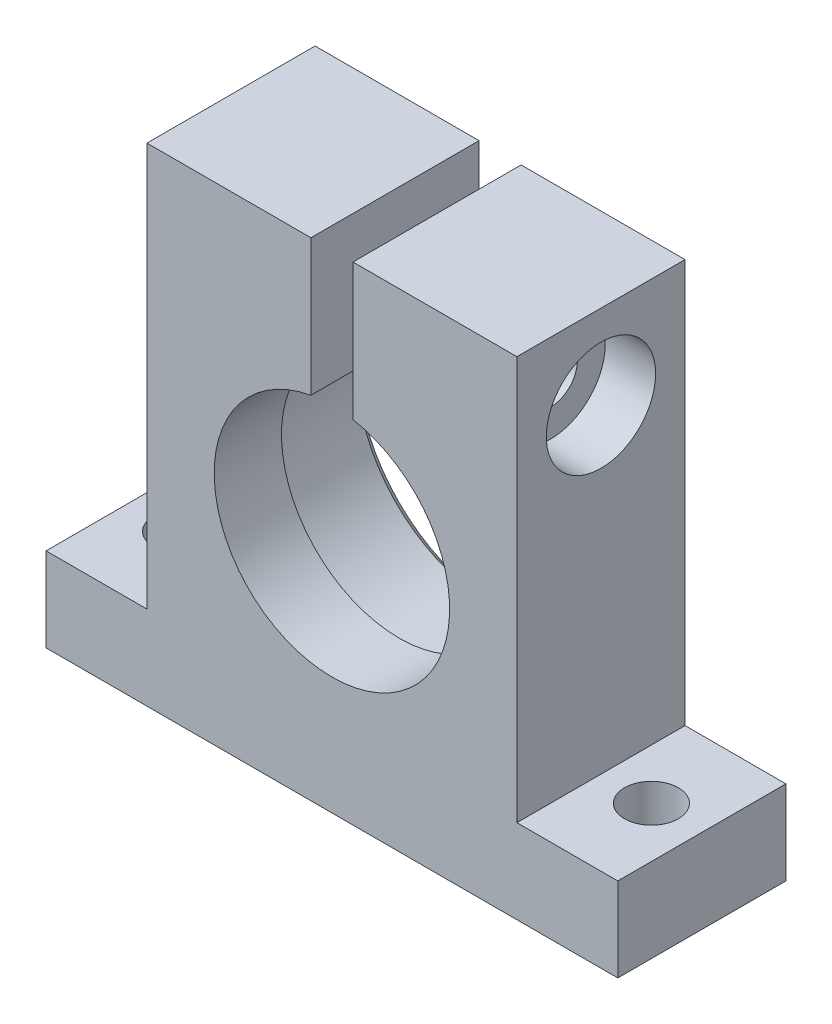
ISO-10303-21;
HEADER;
FILE_DESCRIPTION(('STEP AP214'),'2;1');
FILE_NAME('part.step','',(''),(''),'','','');
FILE_SCHEMA(('AUTOMOTIVE_DESIGN { 1 0 10303 214 1 1 1 1 }'));
ENDSEC;
DATA;
#1=APPLICATION_CONTEXT('core data for automotive mechanical design processes');
#2=APPLICATION_PROTOCOL_DEFINITION('international standard','automotive_design',2000,#1);
#3=PRODUCT_CONTEXT('',#1,'mechanical');
#4=PRODUCT('Part','Part','',(#3));
#5=PRODUCT_RELATED_PRODUCT_CATEGORY('part','',(#4));
#6=PRODUCT_DEFINITION_FORMATION('','',#4);
#7=PRODUCT_DEFINITION_CONTEXT('part definition',#1,'design');
#8=PRODUCT_DEFINITION('design','',#6,#7);
#9=PRODUCT_DEFINITION_SHAPE('','',#8);
#10=(LENGTH_UNIT() NAMED_UNIT(*) SI_UNIT(.MILLI.,.METRE.));
#11=(NAMED_UNIT(*) PLANE_ANGLE_UNIT() SI_UNIT($,.RADIAN.));
#12=(NAMED_UNIT(*) SI_UNIT($,.STERADIAN.) SOLID_ANGLE_UNIT());
#13=UNCERTAINTY_MEASURE_WITH_UNIT(LENGTH_MEASURE(1.E-05),#10,'distance_accuracy_value','');
#14=(GEOMETRIC_REPRESENTATION_CONTEXT(3) GLOBAL_UNCERTAINTY_ASSIGNED_CONTEXT((#13)) GLOBAL_UNIT_ASSIGNED_CONTEXT((#10,
#11,#12)) REPRESENTATION_CONTEXT('',''));
#15=CARTESIAN_POINT('',(0.,0.,0.));
#16=DIRECTION('',(0.,0.,1.));
#17=DIRECTION('',(1.,0.,0.));
#18=AXIS2_PLACEMENT_3D('',#15,#16,#17);
#19=CARTESIAN_POINT('',(-11.,-14.,5.));
#20=DIRECTION('',(1.,0.,0.));
#21=DIRECTION('',(0.,0.,-1.));
#22=AXIS2_PLACEMENT_3D('',#19,#20,#21);
#23=PLANE('',#22);
#24=DIRECTION('',(0.,0.,-1.));
#25=VECTOR('',#24,1.);
#26=CARTESIAN_POINT('',(-11.,-9.,5.));
#27=LINE('',#26,#25);
#28=CARTESIAN_POINT('',(-11.,-9.,5.));
#29=VERTEX_POINT('',#28);
#30=CARTESIAN_POINT('',(-11.,-9.,-5.));
#31=VERTEX_POINT('',#30);
#32=EDGE_CURVE('E273',#29,#31,#27,.T.);
#33=ORIENTED_EDGE('',*,*,#32,.F.);
#34=DIRECTION('',(0.,-1.,0.));
#35=VECTOR('',#34,1.);
#36=CARTESIAN_POINT('',(-11.,-14.,5.));
#37=LINE('',#36,#35);
#38=CARTESIAN_POINT('',(-11.,15.,5.));
#39=VERTEX_POINT('',#38);
#40=EDGE_CURVE('E177',#39,#29,#37,.T.);
#41=ORIENTED_EDGE('',*,*,#40,.F.);
#42=DIRECTION('',(0.,0.,-1.));
#43=VECTOR('',#42,1.);
#44=CARTESIAN_POINT('',(-11.,15.,5.));
#45=LINE('',#44,#43);
#46=CARTESIAN_POINT('',(-11.,15.,-5.));
#47=VERTEX_POINT('',#46);
#48=EDGE_CURVE('E187',#39,#47,#45,.T.);
#49=ORIENTED_EDGE('',*,*,#48,.T.);
#50=DIRECTION('',(0.,-1.,0.));
#51=VECTOR('',#50,1.);
#52=CARTESIAN_POINT('',(-11.,-14.,-5.));
#53=LINE('',#52,#51);
#54=EDGE_CURVE('E360',#47,#31,#53,.T.);
#55=ORIENTED_EDGE('',*,*,#54,.T.);
#56=EDGE_LOOP('',(#33,#41,#49,#55));
#57=FACE_BOUND('',#56,.T.);
#58=CARTESIAN_POINT('',(-11.,10.,0.));
#59=DIRECTION('',(-1.,0.,0.));
#60=DIRECTION('',(0.,0.,1.));
#61=AXIS2_PLACEMENT_3D('',#58,#59,#60);
#62=CIRCLE('',#61,1.24999999999999);
#63=CARTESIAN_POINT('',(-11.,10.,1.24999999999999));
#64=VERTEX_POINT('',#63);
#65=EDGE_CURVE('E276',#64,#64,#62,.T.);
#66=ORIENTED_EDGE('',*,*,#65,.F.);
#67=EDGE_LOOP('',(#66));
#68=FACE_BOUND('',#67,.T.);
#69=ADVANCED_FACE('F43',(#57,#68),#23,.F.);
#70=CARTESIAN_POINT('',(11.,15.,5.));
#71=DIRECTION('',(0.,-1.,0.));
#72=DIRECTION('',(1.,0.,0.));
#73=AXIS2_PLACEMENT_3D('',#70,#71,#72);
#74=PLANE('',#73);
#75=DIRECTION('',(-1.,0.,0.));
#76=VECTOR('',#75,1.);
#77=CARTESIAN_POINT('',(11.,15.,5.));
#78=LINE('',#77,#76);
#79=CARTESIAN_POINT('',(-1.25,15.,5.));
#80=VERTEX_POINT('',#79);
#81=EDGE_CURVE('E365',#80,#39,#78,.T.);
#82=ORIENTED_EDGE('',*,*,#81,.F.);
#83=DIRECTION('',(0.,0.,1.));
#84=VECTOR('',#83,1.);
#85=CARTESIAN_POINT('',(-1.25,15.,-5.));
#86=LINE('',#85,#84);
#87=CARTESIAN_POINT('',(-1.25,15.,-5.));
#88=VERTEX_POINT('',#87);
#89=EDGE_CURVE('E171',#88,#80,#86,.T.);
#90=ORIENTED_EDGE('',*,*,#89,.F.);
#91=DIRECTION('',(-1.,0.,0.));
#92=VECTOR('',#91,1.);
#93=CARTESIAN_POINT('',(11.,15.,-5.));
#94=LINE('',#93,#92);
#95=EDGE_CURVE('E178',#88,#47,#94,.T.);
#96=ORIENTED_EDGE('',*,*,#95,.T.);
#97=ORIENTED_EDGE('',*,*,#48,.F.);
#98=EDGE_LOOP('',(#82,#90,#96,#97));
#99=FACE_BOUND('',#98,.T.);
#100=ADVANCED_FACE('F256',(#99),#74,.F.);
#101=CARTESIAN_POINT('',(11.,-14.,5.));
#102=DIRECTION('',(-1.,0.,0.));
#103=DIRECTION('',(0.,0.,1.));
#104=AXIS2_PLACEMENT_3D('',#101,#102,#103);
#105=PLANE('',#104);
#106=CARTESIAN_POINT('',(11.,10.,0.));
#107=DIRECTION('',(1.,0.,0.));
#108=DIRECTION('',(0.,0.,-1.));
#109=AXIS2_PLACEMENT_3D('',#106,#107,#108);
#110=CIRCLE('',#109,3.25);
#111=CARTESIAN_POINT('',(11.,10.,-3.25));
#112=VERTEX_POINT('',#111);
#113=EDGE_CURVE('E622',#112,#112,#110,.T.);
#114=ORIENTED_EDGE('',*,*,#113,.F.);
#115=EDGE_LOOP('',(#114));
#116=FACE_BOUND('',#115,.T.);
#117=DIRECTION('',(0.,0.,1.));
#118=VECTOR('',#117,1.);
#119=CARTESIAN_POINT('',(11.,-9.,5.));
#120=LINE('',#119,#118);
#121=CARTESIAN_POINT('',(11.,-9.,-5.));
#122=VERTEX_POINT('',#121);
#123=CARTESIAN_POINT('',(11.,-9.,5.));
#124=VERTEX_POINT('',#123);
#125=EDGE_CURVE('E349',#122,#124,#120,.T.);
#126=ORIENTED_EDGE('',*,*,#125,.F.);
#127=DIRECTION('',(0.,1.,0.));
#128=VECTOR('',#127,1.);
#129=CARTESIAN_POINT('',(11.,-14.,-5.));
#130=LINE('',#129,#128);
#131=CARTESIAN_POINT('',(11.,15.,-5.));
#132=VERTEX_POINT('',#131);
#133=EDGE_CURVE('E183',#122,#132,#130,.T.);
#134=ORIENTED_EDGE('',*,*,#133,.T.);
#135=DIRECTION('',(0.,0.,-1.));
#136=VECTOR('',#135,1.);
#137=CARTESIAN_POINT('',(11.,15.,5.));
#138=LINE('',#137,#136);
#139=CARTESIAN_POINT('',(11.,15.,5.));
#140=VERTEX_POINT('',#139);
#141=EDGE_CURVE('E176',#140,#132,#138,.T.);
#142=ORIENTED_EDGE('',*,*,#141,.F.);
#143=DIRECTION('',(0.,1.,0.));
#144=VECTOR('',#143,1.);
#145=CARTESIAN_POINT('',(11.,-14.,5.));
#146=LINE('',#145,#144);
#147=EDGE_CURVE('E363',#124,#140,#146,.T.);
#148=ORIENTED_EDGE('',*,*,#147,.F.);
#149=EDGE_LOOP('',(#126,#134,#142,#148));
#150=FACE_BOUND('',#149,.T.);
#151=ADVANCED_FACE('F257',(#116,#150),#105,.F.);
#152=CARTESIAN_POINT('',(11.,-14.,5.));
#153=DIRECTION('',(0.,1.,0.));
#154=DIRECTION('',(-1.,0.,0.));
#155=AXIS2_PLACEMENT_3D('',#152,#153,#154);
#156=PLANE('',#155);
#157=CARTESIAN_POINT('',(-14.,-14.,0.));
#158=DIRECTION('',(0.,1.,0.));
#159=DIRECTION('',(0.,0.,1.));
#160=AXIS2_PLACEMENT_3D('',#157,#158,#159);
#161=CIRCLE('',#160,1.6);
#162=CARTESIAN_POINT('',(-14.,-14.,1.6));
#163=VERTEX_POINT('',#162);
#164=EDGE_CURVE('E307',#163,#163,#161,.T.);
#165=ORIENTED_EDGE('',*,*,#164,.T.);
#166=EDGE_LOOP('',(#165));
#167=FACE_BOUND('',#166,.T.);
#168=CARTESIAN_POINT('',(14.,-14.,0.));
#169=DIRECTION('',(0.,1.,0.));
#170=DIRECTION('',(0.,0.,1.));
#171=AXIS2_PLACEMENT_3D('',#168,#169,#170);
#172=CIRCLE('',#171,1.6);
#173=CARTESIAN_POINT('',(14.,-14.,1.6));
#174=VERTEX_POINT('',#173);
#175=EDGE_CURVE('E313',#174,#174,#172,.T.);
#176=ORIENTED_EDGE('',*,*,#175,.T.);
#177=EDGE_LOOP('',(#176));
#178=FACE_BOUND('',#177,.T.);
#179=DIRECTION('',(1.,0.,0.));
#180=VECTOR('',#179,1.);
#181=CARTESIAN_POINT('',(11.,-14.,-5.));
#182=LINE('',#181,#180);
#183=CARTESIAN_POINT('',(-17.,-14.,-5.));
#184=VERTEX_POINT('',#183);
#185=CARTESIAN_POINT('',(17.,-14.,-5.));
#186=VERTEX_POINT('',#185);
#187=EDGE_CURVE('E367',#184,#186,#182,.T.);
#188=ORIENTED_EDGE('',*,*,#187,.T.);
#189=DIRECTION('',(0.,0.,1.));
#190=VECTOR('',#189,1.);
#191=CARTESIAN_POINT('',(17.,-14.,-5.));
#192=LINE('',#191,#190);
#193=CARTESIAN_POINT('',(17.,-14.,5.));
#194=VERTEX_POINT('',#193);
#195=EDGE_CURVE('E330',#186,#194,#192,.T.);
#196=ORIENTED_EDGE('',*,*,#195,.T.);
#197=DIRECTION('',(1.,0.,0.));
#198=VECTOR('',#197,1.);
#199=CARTESIAN_POINT('',(11.,-14.,5.));
#200=LINE('',#199,#198);
#201=CARTESIAN_POINT('',(-17.,-14.,5.));
#202=VERTEX_POINT('',#201);
#203=EDGE_CURVE('E181',#202,#194,#200,.T.);
#204=ORIENTED_EDGE('',*,*,#203,.F.);
#205=DIRECTION('',(0.,0.,-1.));
#206=VECTOR('',#205,1.);
#207=CARTESIAN_POINT('',(-17.,-14.,-5.));
#208=LINE('',#207,#206);
#209=EDGE_CURVE('E325',#202,#184,#208,.T.);
#210=ORIENTED_EDGE('',*,*,#209,.T.);
#211=EDGE_LOOP('',(#188,#196,#204,#210));
#212=FACE_BOUND('',#211,.T.);
#213=ADVANCED_FACE('F255',(#167,#178,#212),#156,.F.);
#214=CARTESIAN_POINT('',(1.25,15.,-5.));
#215=VERTEX_POINT('',#214);
#216=EDGE_CURVE('E158',#132,#215,#94,.T.);
#217=ORIENTED_EDGE('',*,*,#216,.T.);
#218=DIRECTION('',(0.,0.,1.));
#219=VECTOR('',#218,1.);
#220=CARTESIAN_POINT('',(1.25,15.,-5.));
#221=LINE('',#220,#219);
#222=CARTESIAN_POINT('',(1.25,15.,5.));
#223=VERTEX_POINT('',#222);
#224=EDGE_CURVE('E161',#215,#223,#221,.T.);
#225=ORIENTED_EDGE('',*,*,#224,.T.);
#226=EDGE_CURVE('E190',#140,#223,#78,.T.);
#227=ORIENTED_EDGE('',*,*,#226,.F.);
#228=ORIENTED_EDGE('',*,*,#141,.T.);
#229=EDGE_LOOP('',(#217,#225,#227,#228));
#230=FACE_BOUND('',#229,.T.);
#231=ADVANCED_FACE('F174',(#230),#74,.F.);
#232=CARTESIAN_POINT('',(0.,0.,5.));
#233=DIRECTION('',(0.,0.,1.));
#234=DIRECTION('',(1.,0.,0.));
#235=AXIS2_PLACEMENT_3D('',#232,#233,#234);
#236=PLANE('',#235);
#237=DIRECTION('',(0.,-1.,0.));
#238=VECTOR('',#237,1.);
#239=CARTESIAN_POINT('',(-1.25,6.88748865697795,5.));
#240=LINE('',#239,#238);
#241=CARTESIAN_POINT('',(-1.25,6.88748865697795,5.));
#242=VERTEX_POINT('',#241);
#243=EDGE_CURVE('E282',#80,#242,#240,.T.);
#244=ORIENTED_EDGE('',*,*,#243,.F.);
#245=ORIENTED_EDGE('',*,*,#81,.T.);
#246=ORIENTED_EDGE('',*,*,#40,.T.);
#247=DIRECTION('',(-1.,0.,0.));
#248=VECTOR('',#247,1.);
#249=CARTESIAN_POINT('',(17.,-9.,5.));
#250=LINE('',#249,#248);
#251=CARTESIAN_POINT('',(-17.,-9.,5.));
#252=VERTEX_POINT('',#251);
#253=EDGE_CURVE('E337',#29,#252,#250,.T.);
#254=ORIENTED_EDGE('',*,*,#253,.T.);
#255=DIRECTION('',(0.,-1.,0.));
#256=VECTOR('',#255,1.);
#257=CARTESIAN_POINT('',(-17.,-9.,5.));
#258=LINE('',#257,#256);
#259=EDGE_CURVE('E346',#252,#202,#258,.T.);
#260=ORIENTED_EDGE('',*,*,#259,.T.);
#261=ORIENTED_EDGE('',*,*,#203,.T.);
#262=DIRECTION('',(0.,-1.,0.));
#263=VECTOR('',#262,1.);
#264=CARTESIAN_POINT('',(17.,-9.,5.));
#265=LINE('',#264,#263);
#266=CARTESIAN_POINT('',(17.,-9.,5.));
#267=VERTEX_POINT('',#266);
#268=EDGE_CURVE('E350',#267,#194,#265,.T.);
#269=ORIENTED_EDGE('',*,*,#268,.F.);
#270=EDGE_CURVE('E338',#267,#124,#250,.T.);
#271=ORIENTED_EDGE('',*,*,#270,.T.);
#272=ORIENTED_EDGE('',*,*,#147,.T.);
#273=ORIENTED_EDGE('',*,*,#226,.T.);
#274=DIRECTION('',(0.,1.,0.));
#275=VECTOR('',#274,1.);
#276=CARTESIAN_POINT('',(1.25,6.88748865697795,5.));
#277=LINE('',#276,#275);
#278=CARTESIAN_POINT('',(1.25,6.88748865697795,5.));
#279=VERTEX_POINT('',#278);
#280=EDGE_CURVE('E167',#279,#223,#277,.T.);
#281=ORIENTED_EDGE('',*,*,#280,.F.);
#282=CARTESIAN_POINT('',(0.,0.,5.));
#283=DIRECTION('',(0.,0.,-1.));
#284=DIRECTION('',(-1.,0.,0.));
#285=AXIS2_PLACEMENT_3D('',#282,#283,#284);
#286=CIRCLE('',#285,7.);
#287=EDGE_CURVE('E319',#279,#242,#286,.T.);
#288=ORIENTED_EDGE('',*,*,#287,.T.);
#289=EDGE_LOOP('',(#244,#245,#246,#254,#260,#261,#269,#271,#272,#273,#281,#288));
#290=FACE_BOUND('',#289,.T.);
#291=ADVANCED_FACE('F247',(#290),#236,.T.);
#292=CARTESIAN_POINT('',(0.,0.,-5.));
#293=DIRECTION('',(0.,0.,1.));
#294=DIRECTION('',(1.,0.,0.));
#295=AXIS2_PLACEMENT_3D('',#292,#293,#294);
#296=PLANE('',#295);
#297=DIRECTION('',(0.,-1.,0.));
#298=VECTOR('',#297,1.);
#299=CARTESIAN_POINT('',(-1.25,6.88748865697795,-5.));
#300=LINE('',#299,#298);
#301=CARTESIAN_POINT('',(-1.25,8.4075858604001,-5.));
#302=VERTEX_POINT('',#301);
#303=EDGE_CURVE('E162',#88,#302,#300,.T.);
#304=ORIENTED_EDGE('',*,*,#303,.T.);
#305=CARTESIAN_POINT('',(0.,0.,-5.));
#306=DIRECTION('',(0.,0.,1.));
#307=DIRECTION('',(1.,0.,0.));
#308=AXIS2_PLACEMENT_3D('',#305,#306,#307);
#309=CIRCLE('',#308,8.49999999999999);
#310=CARTESIAN_POINT('',(1.25,8.4075858604001,-5.));
#311=VERTEX_POINT('',#310);
#312=EDGE_CURVE('E58',#302,#311,#309,.T.);
#313=ORIENTED_EDGE('',*,*,#312,.T.);
#314=DIRECTION('',(0.,1.,0.));
#315=VECTOR('',#314,1.);
#316=CARTESIAN_POINT('',(1.25,6.88748865697795,-5.));
#317=LINE('',#316,#315);
#318=EDGE_CURVE('E153',#311,#215,#317,.T.);
#319=ORIENTED_EDGE('',*,*,#318,.T.);
#320=ORIENTED_EDGE('',*,*,#216,.F.);
#321=ORIENTED_EDGE('',*,*,#133,.F.);
#322=DIRECTION('',(1.,0.,0.));
#323=VECTOR('',#322,1.);
#324=CARTESIAN_POINT('',(17.,-9.,-5.));
#325=LINE('',#324,#323);
#326=CARTESIAN_POINT('',(17.,-9.,-5.));
#327=VERTEX_POINT('',#326);
#328=EDGE_CURVE('E329',#122,#327,#325,.T.);
#329=ORIENTED_EDGE('',*,*,#328,.T.);
#330=DIRECTION('',(0.,-1.,0.));
#331=VECTOR('',#330,1.);
#332=CARTESIAN_POINT('',(17.,-9.,-5.));
#333=LINE('',#332,#331);
#334=EDGE_CURVE('E353',#327,#186,#333,.T.);
#335=ORIENTED_EDGE('',*,*,#334,.T.);
#336=ORIENTED_EDGE('',*,*,#187,.F.);
#337=DIRECTION('',(0.,-1.,0.));
#338=VECTOR('',#337,1.);
#339=CARTESIAN_POINT('',(-17.,-9.,-5.));
#340=LINE('',#339,#338);
#341=CARTESIAN_POINT('',(-17.,-9.,-5.));
#342=VERTEX_POINT('',#341);
#343=EDGE_CURVE('E341',#342,#184,#340,.T.);
#344=ORIENTED_EDGE('',*,*,#343,.F.);
#345=EDGE_CURVE('E331',#342,#31,#325,.T.);
#346=ORIENTED_EDGE('',*,*,#345,.T.);
#347=ORIENTED_EDGE('',*,*,#54,.F.);
#348=ORIENTED_EDGE('',*,*,#95,.F.);
#349=EDGE_LOOP('',(#304,#313,#319,#320,#321,#329,#335,#336,#344,#346,#347,#348));
#350=FACE_BOUND('',#349,.T.);
#351=ADVANCED_FACE('F155',(#350),#296,.F.);
#352=CARTESIAN_POINT('',(17.,-9.,-5.));
#353=DIRECTION('',(1.,0.,0.));
#354=DIRECTION('',(0.,1.,0.));
#355=AXIS2_PLACEMENT_3D('',#352,#353,#354);
#356=PLANE('',#355);
#357=ORIENTED_EDGE('',*,*,#195,.F.);
#358=ORIENTED_EDGE('',*,*,#334,.F.);
#359=DIRECTION('',(0.,0.,1.));
#360=VECTOR('',#359,1.);
#361=CARTESIAN_POINT('',(17.,-9.,-5.));
#362=LINE('',#361,#360);
#363=EDGE_CURVE('E334',#327,#267,#362,.T.);
#364=ORIENTED_EDGE('',*,*,#363,.T.);
#365=ORIENTED_EDGE('',*,*,#268,.T.);
#366=EDGE_LOOP('',(#357,#358,#364,#365));
#367=FACE_BOUND('',#366,.T.);
#368=ADVANCED_FACE('F240',(#367),#356,.T.);
#369=CARTESIAN_POINT('',(0.,-9.,0.));
#370=DIRECTION('',(0.,-1.,0.));
#371=DIRECTION('',(1.,0.,0.));
#372=AXIS2_PLACEMENT_3D('',#369,#370,#371);
#373=PLANE('',#372);
#374=CARTESIAN_POINT('',(14.,-9.,0.));
#375=DIRECTION('',(0.,1.,0.));
#376=DIRECTION('',(0.,0.,1.));
#377=AXIS2_PLACEMENT_3D('',#374,#375,#376);
#378=CIRCLE('',#377,1.6);
#379=CARTESIAN_POINT('',(14.,-9.,1.6));
#380=VERTEX_POINT('',#379);
#381=EDGE_CURVE('E310',#380,#380,#378,.T.);
#382=ORIENTED_EDGE('',*,*,#381,.F.);
#383=EDGE_LOOP('',(#382));
#384=FACE_BOUND('',#383,.T.);
#385=ORIENTED_EDGE('',*,*,#328,.F.);
#386=ORIENTED_EDGE('',*,*,#125,.T.);
#387=ORIENTED_EDGE('',*,*,#270,.F.);
#388=ORIENTED_EDGE('',*,*,#363,.F.);
#389=EDGE_LOOP('',(#385,#386,#387,#388));
#390=FACE_BOUND('',#389,.T.);
#391=ADVANCED_FACE('F238',(#384,#390),#373,.F.);
#392=CARTESIAN_POINT('',(-14.,-9.,0.));
#393=DIRECTION('',(0.,1.,0.));
#394=DIRECTION('',(0.,0.,1.));
#395=AXIS2_PLACEMENT_3D('',#392,#393,#394);
#396=CIRCLE('',#395,1.6);
#397=CARTESIAN_POINT('',(-14.,-9.,1.6));
#398=VERTEX_POINT('',#397);
#399=EDGE_CURVE('E304',#398,#398,#396,.T.);
#400=ORIENTED_EDGE('',*,*,#399,.F.);
#401=EDGE_LOOP('',(#400));
#402=FACE_BOUND('',#401,.T.);
#403=ORIENTED_EDGE('',*,*,#253,.F.);
#404=ORIENTED_EDGE('',*,*,#32,.T.);
#405=ORIENTED_EDGE('',*,*,#345,.F.);
#406=DIRECTION('',(0.,0.,-1.));
#407=VECTOR('',#406,1.);
#408=CARTESIAN_POINT('',(-17.,-9.,-5.));
#409=LINE('',#408,#407);
#410=EDGE_CURVE('E326',#252,#342,#409,.T.);
#411=ORIENTED_EDGE('',*,*,#410,.F.);
#412=EDGE_LOOP('',(#403,#404,#405,#411));
#413=FACE_BOUND('',#412,.T.);
#414=ADVANCED_FACE('F235',(#402,#413),#373,.F.);
#415=CARTESIAN_POINT('',(-17.,-9.,-5.));
#416=DIRECTION('',(-1.,0.,0.));
#417=DIRECTION('',(0.,-1.,0.));
#418=AXIS2_PLACEMENT_3D('',#415,#416,#417);
#419=PLANE('',#418);
#420=ORIENTED_EDGE('',*,*,#209,.F.);
#421=ORIENTED_EDGE('',*,*,#259,.F.);
#422=ORIENTED_EDGE('',*,*,#410,.T.);
#423=ORIENTED_EDGE('',*,*,#343,.T.);
#424=EDGE_LOOP('',(#420,#421,#422,#423));
#425=FACE_BOUND('',#424,.T.);
#426=ADVANCED_FACE('F233',(#425),#419,.T.);
#427=CARTESIAN_POINT('',(0.,0.,1.));
#428=DIRECTION('',(0.,0.,1.));
#429=DIRECTION('',(1.,0.,0.));
#430=AXIS2_PLACEMENT_3D('',#427,#428,#429);
#431=PLANE('',#430);
#432=CARTESIAN_POINT('',(0.,0.,1.));
#433=DIRECTION('',(0.,0.,-1.));
#434=DIRECTION('',(-1.,0.,0.));
#435=AXIS2_PLACEMENT_3D('',#432,#433,#434);
#436=CIRCLE('',#435,8.);
#437=CARTESIAN_POINT('',(1.25,7.90174031463955,1.));
#438=VERTEX_POINT('',#437);
#439=CARTESIAN_POINT('',(-1.25,7.90174031463955,1.));
#440=VERTEX_POINT('',#439);
#441=EDGE_CURVE('E322',#438,#440,#436,.T.);
#442=ORIENTED_EDGE('',*,*,#441,.T.);
#443=DIRECTION('',(0.,-1.,0.));
#444=VECTOR('',#443,1.);
#445=CARTESIAN_POINT('',(-1.25,0.,1.));
#446=LINE('',#445,#444);
#447=CARTESIAN_POINT('',(-1.25,6.88748865697795,1.));
#448=VERTEX_POINT('',#447);
#449=EDGE_CURVE('E301',#440,#448,#446,.T.);
#450=ORIENTED_EDGE('',*,*,#449,.T.);
#451=CARTESIAN_POINT('',(0.,0.,1.));
#452=DIRECTION('',(0.,0.,-1.));
#453=DIRECTION('',(-1.,0.,0.));
#454=AXIS2_PLACEMENT_3D('',#451,#452,#453);
#455=CIRCLE('',#454,7.);
#456=CARTESIAN_POINT('',(1.25,6.88748865697796,1.));
#457=VERTEX_POINT('',#456);
#458=EDGE_CURVE('E316',#457,#448,#455,.T.);
#459=ORIENTED_EDGE('',*,*,#458,.F.);
#460=DIRECTION('',(0.,1.,0.));
#461=VECTOR('',#460,1.);
#462=CARTESIAN_POINT('',(1.25,0.,1.));
#463=LINE('',#462,#461);
#464=EDGE_CURVE('E296',#457,#438,#463,.T.);
#465=ORIENTED_EDGE('',*,*,#464,.T.);
#466=EDGE_LOOP('',(#442,#450,#459,#465));
#467=FACE_BOUND('',#466,.T.);
#468=ADVANCED_FACE('F229',(#467),#431,.F.);
#469=CARTESIAN_POINT('',(0.,0.,-5.));
#470=DIRECTION('',(0.,0.,-1.));
#471=DIRECTION('',(-1.,0.,0.));
#472=AXIS2_PLACEMENT_3D('',#469,#470,#471);
#473=CYLINDRICAL_SURFACE('',#472,7.99999999999999);
#474=DIRECTION('',(0.,0.,-1.));
#475=VECTOR('',#474,1.);
#476=CARTESIAN_POINT('',(1.25,7.90174031463955,-5.));
#477=LINE('',#476,#475);
#478=CARTESIAN_POINT('',(1.25,7.90174031463955,-4.50000000000001));
#479=VERTEX_POINT('',#478);
#480=EDGE_CURVE('E292',#438,#479,#477,.T.);
#481=ORIENTED_EDGE('',*,*,#480,.T.);
#482=CARTESIAN_POINT('',(0.,0.,-4.50000000000001));
#483=DIRECTION('',(0.,0.,1.));
#484=DIRECTION('',(1.,0.,0.));
#485=AXIS2_PLACEMENT_3D('',#482,#483,#484);
#486=CIRCLE('',#485,7.99999999999999);
#487=CARTESIAN_POINT('',(-1.25,7.90174031463955,-4.50000000000001));
#488=VERTEX_POINT('',#487);
#489=EDGE_CURVE('E198',#479,#488,#486,.F.);
#490=ORIENTED_EDGE('',*,*,#489,.T.);
#491=DIRECTION('',(0.,0.,-1.));
#492=VECTOR('',#491,1.);
#493=CARTESIAN_POINT('',(-1.25,7.90174031463955,-5.));
#494=LINE('',#493,#492);
#495=EDGE_CURVE('E299',#488,#440,#494,.F.);
#496=ORIENTED_EDGE('',*,*,#495,.T.);
#497=ORIENTED_EDGE('',*,*,#441,.F.);
#498=EDGE_LOOP('',(#481,#490,#496,#497));
#499=FACE_BOUND('',#498,.T.);
#500=ADVANCED_FACE('F225',(#499),#473,.F.);
#501=CARTESIAN_POINT('',(0.,0.,1.));
#502=DIRECTION('',(0.,0.,-1.));
#503=DIRECTION('',(-1.,0.,0.));
#504=AXIS2_PLACEMENT_3D('',#501,#502,#503);
#505=CYLINDRICAL_SURFACE('',#504,7.);
#506=ORIENTED_EDGE('',*,*,#458,.T.);
#507=DIRECTION('',(0.,0.,-1.));
#508=VECTOR('',#507,1.);
#509=CARTESIAN_POINT('',(-1.25,6.88748865697795,1.));
#510=LINE('',#509,#508);
#511=EDGE_CURVE('E195',#448,#242,#510,.F.);
#512=ORIENTED_EDGE('',*,*,#511,.T.);
#513=ORIENTED_EDGE('',*,*,#287,.F.);
#514=DIRECTION('',(0.,0.,-1.));
#515=VECTOR('',#514,1.);
#516=CARTESIAN_POINT('',(1.25,6.88748865697795,1.));
#517=LINE('',#516,#515);
#518=EDGE_CURVE('E192',#279,#457,#517,.T.);
#519=ORIENTED_EDGE('',*,*,#518,.T.);
#520=EDGE_LOOP('',(#506,#512,#513,#519));
#521=FACE_BOUND('',#520,.T.);
#522=ADVANCED_FACE('F221',(#521),#505,.F.);
#523=CARTESIAN_POINT('',(14.,-9.,0.));
#524=DIRECTION('',(0.,1.,0.));
#525=DIRECTION('',(0.,0.,1.));
#526=AXIS2_PLACEMENT_3D('',#523,#524,#525);
#527=CYLINDRICAL_SURFACE('',#526,1.6);
#528=ORIENTED_EDGE('',*,*,#175,.F.);
#529=EDGE_LOOP('',(#528));
#530=FACE_BOUND('',#529,.T.);
#531=ORIENTED_EDGE('',*,*,#381,.T.);
#532=EDGE_LOOP('',(#531));
#533=FACE_BOUND('',#532,.T.);
#534=ADVANCED_FACE('F217',(#530,#533),#527,.F.);
#535=CARTESIAN_POINT('',(-14.,-9.,0.));
#536=DIRECTION('',(0.,1.,0.));
#537=DIRECTION('',(0.,0.,1.));
#538=AXIS2_PLACEMENT_3D('',#535,#536,#537);
#539=CYLINDRICAL_SURFACE('',#538,1.6);
#540=ORIENTED_EDGE('',*,*,#164,.F.);
#541=EDGE_LOOP('',(#540));
#542=FACE_BOUND('',#541,.T.);
#543=ORIENTED_EDGE('',*,*,#399,.T.);
#544=EDGE_LOOP('',(#543));
#545=FACE_BOUND('',#544,.T.);
#546=ADVANCED_FACE('F214',(#542,#545),#539,.F.);
#547=CARTESIAN_POINT('',(1.25,6.88748865697795,-5.));
#548=DIRECTION('',(1.,0.,0.));
#549=DIRECTION('',(0.,0.,-1.));
#550=AXIS2_PLACEMENT_3D('',#547,#548,#549);
#551=PLANE('',#550);
#552=CARTESIAN_POINT('',(1.25,10.,0.));
#553=DIRECTION('',(1.,0.,0.));
#554=DIRECTION('',(0.,0.,-1.));
#555=AXIS2_PLACEMENT_3D('',#552,#553,#554);
#556=CIRCLE('',#555,1.6);
#557=CARTESIAN_POINT('',(1.25,10.,-1.6));
#558=VERTEX_POINT('',#557);
#559=EDGE_CURVE('E279',#558,#558,#556,.T.);
#560=ORIENTED_EDGE('',*,*,#559,.T.);
#561=EDGE_LOOP('',(#560));
#562=FACE_BOUND('',#561,.T.);
#563=ORIENTED_EDGE('',*,*,#318,.F.);
#564=CARTESIAN_POINT('',(1.25,8.4075858604001,-5.));
#565=CARTESIAN_POINT('',(1.25,8.3233079630533,-4.91663662606483));
#566=CARTESIAN_POINT('',(1.25,8.23901521894041,-4.83328827247064));
#567=CARTESIAN_POINT('',(1.25,8.07040003702028,-4.66662160580392));
#568=CARTESIAN_POINT('',(1.25,7.98607759921299,-4.58330329273145));
#569=CARTESIAN_POINT('',(1.25,7.90174031463955,-4.50000000000001));
#570=B_SPLINE_CURVE_WITH_KNOTS('',3,(#564,#565,#566,#567,#568,#569),.UNSPECIFIED.,.F.,.F.,(4,2,
4),(0.,0.355626113794366,0.711252228272866),.UNSPECIFIED.);
#571=EDGE_CURVE('E11',#311,#479,#570,.T.);
#572=ORIENTED_EDGE('',*,*,#571,.T.);
#573=ORIENTED_EDGE('',*,*,#480,.F.);
#574=ORIENTED_EDGE('',*,*,#464,.F.);
#575=ORIENTED_EDGE('',*,*,#518,.F.);
#576=ORIENTED_EDGE('',*,*,#280,.T.);
#577=ORIENTED_EDGE('',*,*,#224,.F.);
#578=EDGE_LOOP('',(#563,#572,#573,#574,#575,#576,#577));
#579=FACE_BOUND('',#578,.T.);
#580=ADVANCED_FACE('F165',(#562,#579),#551,.F.);
#581=CARTESIAN_POINT('',(-1.25,6.88748865697795,-5.));
#582=DIRECTION('',(-1.,0.,0.));
#583=DIRECTION('',(0.,0.,1.));
#584=AXIS2_PLACEMENT_3D('',#581,#582,#583);
#585=PLANE('',#584);
#586=CARTESIAN_POINT('',(-1.25,10.,0.));
#587=DIRECTION('',(-1.,0.,0.));
#588=DIRECTION('',(0.,0.,1.));
#589=AXIS2_PLACEMENT_3D('',#586,#587,#588);
#590=CIRCLE('',#589,1.24999999999999);
#591=CARTESIAN_POINT('',(-1.25,10.,1.24999999999999));
#592=VERTEX_POINT('',#591);
#593=EDGE_CURVE('E278',#592,#592,#590,.T.);
#594=ORIENTED_EDGE('',*,*,#593,.T.);
#595=EDGE_LOOP('',(#594));
#596=FACE_BOUND('',#595,.T.);
#597=ORIENTED_EDGE('',*,*,#495,.F.);
#598=CARTESIAN_POINT('',(-1.25,7.90174031463955,-4.50000000000001));
#599=CARTESIAN_POINT('',(-1.25,7.98607759921298,-4.58330329273145));
#600=CARTESIAN_POINT('',(-1.25,8.07040003702028,-4.66662160580392));
#601=CARTESIAN_POINT('',(-1.25,8.23901521894041,-4.83328827247064));
#602=CARTESIAN_POINT('',(-1.25,8.3233079630533,-4.91663662606483));
#603=CARTESIAN_POINT('',(-1.25,8.4075858604001,-5.));
#604=B_SPLINE_CURVE_WITH_KNOTS('',3,(#598,#599,#600,#601,#602,#603),.UNSPECIFIED.,.F.,.F.,(4,2,
4),(0.,0.355626114478499,0.711252228272866),.UNSPECIFIED.);
#605=EDGE_CURVE('E72',#488,#302,#604,.T.);
#606=ORIENTED_EDGE('',*,*,#605,.T.);
#607=ORIENTED_EDGE('',*,*,#303,.F.);
#608=ORIENTED_EDGE('',*,*,#89,.T.);
#609=ORIENTED_EDGE('',*,*,#243,.T.);
#610=ORIENTED_EDGE('',*,*,#511,.F.);
#611=ORIENTED_EDGE('',*,*,#449,.F.);
#612=EDGE_LOOP('',(#597,#606,#607,#608,#609,#610,#611));
#613=FACE_BOUND('',#612,.T.);
#614=ADVANCED_FACE('F206',(#596,#613),#585,.F.);
#615=CARTESIAN_POINT('',(-11.,10.,0.));
#616=DIRECTION('',(-1.,0.,0.));
#617=DIRECTION('',(0.,0.,1.));
#618=AXIS2_PLACEMENT_3D('',#615,#616,#617);
#619=CYLINDRICAL_SURFACE('',#618,1.24999999999999);
#620=ORIENTED_EDGE('',*,*,#593,.F.);
#621=EDGE_LOOP('',(#620));
#622=FACE_BOUND('',#621,.T.);
#623=ORIENTED_EDGE('',*,*,#65,.T.);
#624=EDGE_LOOP('',(#623));
#625=FACE_BOUND('',#624,.T.);
#626=ADVANCED_FACE('F210',(#622,#625),#619,.F.);
#627=CARTESIAN_POINT('',(11.,10.,0.));
#628=DIRECTION('',(1.,0.,0.));
#629=DIRECTION('',(0.,0.,-1.));
#630=AXIS2_PLACEMENT_3D('',#627,#628,#629);
#631=CYLINDRICAL_SURFACE('',#630,1.6);
#632=ORIENTED_EDGE('',*,*,#559,.F.);
#633=EDGE_LOOP('',(#632));
#634=FACE_BOUND('',#633,.T.);
#635=CARTESIAN_POINT('',(8.,10.,0.));
#636=DIRECTION('',(1.,0.,0.));
#637=DIRECTION('',(0.,0.,-1.));
#638=AXIS2_PLACEMENT_3D('',#635,#636,#637);
#639=CIRCLE('',#638,1.6);
#640=CARTESIAN_POINT('',(8.,10.,-1.6));
#641=VERTEX_POINT('',#640);
#642=EDGE_CURVE('E285',#641,#641,#639,.T.);
#643=ORIENTED_EDGE('',*,*,#642,.T.);
#644=EDGE_LOOP('',(#643));
#645=FACE_BOUND('',#644,.T.);
#646=ADVANCED_FACE('F404',(#634,#645),#631,.F.);
#647=CARTESIAN_POINT('',(8.,11.6,0.));
#648=DIRECTION('',(-1.,0.,0.));
#649=DIRECTION('',(0.,0.,1.));
#650=AXIS2_PLACEMENT_3D('',#647,#648,#649);
#651=PLANE('',#650);
#652=ORIENTED_EDGE('',*,*,#642,.F.);
#653=EDGE_LOOP('',(#652));
#654=FACE_BOUND('',#653,.T.);
#655=CARTESIAN_POINT('',(8.,10.,0.));
#656=DIRECTION('',(1.,0.,0.));
#657=DIRECTION('',(0.,0.,-1.));
#658=AXIS2_PLACEMENT_3D('',#655,#656,#657);
#659=CIRCLE('',#658,3.25);
#660=CARTESIAN_POINT('',(8.,10.,-3.25));
#661=VERTEX_POINT('',#660);
#662=EDGE_CURVE('E620',#661,#661,#659,.T.);
#663=ORIENTED_EDGE('',*,*,#662,.T.);
#664=EDGE_LOOP('',(#663));
#665=FACE_BOUND('',#664,.T.);
#666=ADVANCED_FACE('F398',(#654,#665),#651,.F.);
#667=CARTESIAN_POINT('',(11.,10.,0.));
#668=DIRECTION('',(1.,0.,0.));
#669=DIRECTION('',(0.,0.,-1.));
#670=AXIS2_PLACEMENT_3D('',#667,#668,#669);
#671=CYLINDRICAL_SURFACE('',#670,3.25);
#672=ORIENTED_EDGE('',*,*,#662,.F.);
#673=EDGE_LOOP('',(#672));
#674=FACE_BOUND('',#673,.T.);
#675=ORIENTED_EDGE('',*,*,#113,.T.);
#676=EDGE_LOOP('',(#675));
#677=FACE_BOUND('',#676,.T.);
#678=ADVANCED_FACE('F394',(#674,#677),#671,.F.);
#679=CARTESIAN_POINT('',(0.,0.,-4.50000000000001));
#680=DIRECTION('',(0.,0.,-1.));
#681=DIRECTION('',(-1.,0.,0.));
#682=AXIS2_PLACEMENT_3D('',#679,#680,#681);
#683=CONICAL_SURFACE('',#682,7.99999999999999,0.785398163397455);
#684=ORIENTED_EDGE('',*,*,#571,.F.);
#685=ORIENTED_EDGE('',*,*,#312,.F.);
#686=ORIENTED_EDGE('',*,*,#605,.F.);
#687=ORIENTED_EDGE('',*,*,#489,.F.);
#688=EDGE_LOOP('',(#684,#685,#686,#687));
#689=FACE_BOUND('',#688,.T.);
#690=ADVANCED_FACE('F46',(#689),#683,.F.);
#691=CLOSED_SHELL('',(#69,#100,#151,#213,#231,#291,#351,#368,#391,#414,#426,#468,#500,#522,#534,
#546,#580,#614,#626,#646,#666,#678,#690));
#692=MANIFOLD_SOLID_BREP('B2',#691);
#693=ADVANCED_BREP_SHAPE_REPRESENTATION('',(#18,#692),#14);
#694=SHAPE_DEFINITION_REPRESENTATION(#9,#693);
ENDSEC;
END-ISO-10303-21;
